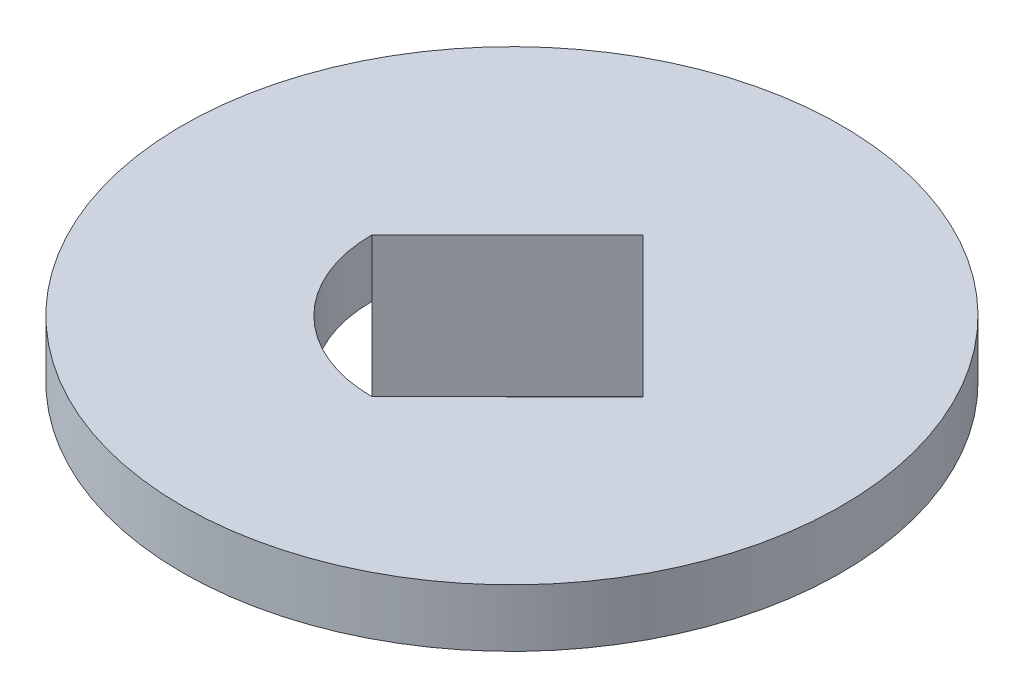
ISO-10303-21;
HEADER;
FILE_DESCRIPTION(('STEP AP214'),'2;1');
FILE_NAME('part.step','',(''),(''),'','','');
FILE_SCHEMA(('AUTOMOTIVE_DESIGN { 1 0 10303 214 1 1 1 1 }'));
ENDSEC;
DATA;
#1=APPLICATION_CONTEXT('core data for automotive mechanical design processes');
#2=APPLICATION_PROTOCOL_DEFINITION('international standard','automotive_design',2000,#1);
#3=PRODUCT_CONTEXT('',#1,'mechanical');
#4=PRODUCT('Part','Part','',(#3));
#5=PRODUCT_RELATED_PRODUCT_CATEGORY('part','',(#4));
#6=PRODUCT_DEFINITION_FORMATION('','',#4);
#7=PRODUCT_DEFINITION_CONTEXT('part definition',#1,'design');
#8=PRODUCT_DEFINITION('design','',#6,#7);
#9=PRODUCT_DEFINITION_SHAPE('','',#8);
#10=(LENGTH_UNIT() NAMED_UNIT(*) SI_UNIT(.MILLI.,.METRE.));
#11=(NAMED_UNIT(*) PLANE_ANGLE_UNIT() SI_UNIT($,.RADIAN.));
#12=(NAMED_UNIT(*) SI_UNIT($,.STERADIAN.) SOLID_ANGLE_UNIT());
#13=UNCERTAINTY_MEASURE_WITH_UNIT(LENGTH_MEASURE(1.E-05),#10,'distance_accuracy_value','');
#14=(GEOMETRIC_REPRESENTATION_CONTEXT(3) GLOBAL_UNCERTAINTY_ASSIGNED_CONTEXT((#13)) GLOBAL_UNIT_ASSIGNED_CONTEXT((#10,
#11,#12)) REPRESENTATION_CONTEXT('',''));
#15=CARTESIAN_POINT('',(0.,0.,0.));
#16=DIRECTION('',(0.,0.,1.));
#17=DIRECTION('',(1.,0.,0.));
#18=AXIS2_PLACEMENT_3D('',#15,#16,#17);
#19=CARTESIAN_POINT('',(0.,1.75,0.));
#20=DIRECTION('',(0.,-1.,0.));
#21=DIRECTION('',(0.,0.,-1.));
#22=AXIS2_PLACEMENT_3D('',#19,#20,#21);
#23=CYLINDRICAL_SURFACE('',#22,10.);
#24=CARTESIAN_POINT('',(0.,1.75,0.));
#25=DIRECTION('',(0.,1.,0.));
#26=DIRECTION('',(0.,0.,1.));
#27=AXIS2_PLACEMENT_3D('',#24,#25,#26);
#28=CIRCLE('',#27,10.);
#29=CARTESIAN_POINT('',(0.,1.75,10.));
#30=VERTEX_POINT('',#29);
#31=EDGE_CURVE('E11',#30,#30,#28,.T.);
#32=ORIENTED_EDGE('',*,*,#31,.F.);
#33=EDGE_LOOP('',(#32));
#34=FACE_BOUND('',#33,.T.);
#35=CARTESIAN_POINT('',(0.,0.,0.));
#36=DIRECTION('',(0.,1.,0.));
#37=DIRECTION('',(0.,0.,1.));
#38=AXIS2_PLACEMENT_3D('',#35,#36,#37);
#39=CIRCLE('',#38,10.);
#40=CARTESIAN_POINT('',(0.,0.,10.));
#41=VERTEX_POINT('',#40);
#42=EDGE_CURVE('E42',#41,#41,#39,.T.);
#43=ORIENTED_EDGE('',*,*,#42,.T.);
#44=EDGE_LOOP('',(#43));
#45=FACE_BOUND('',#44,.T.);
#46=ADVANCED_FACE('F39',(#34,#45),#23,.T.);
#47=CARTESIAN_POINT('',(0.,1.75,0.));
#48=DIRECTION('',(0.,1.,0.));
#49=DIRECTION('',(0.,0.,1.));
#50=AXIS2_PLACEMENT_3D('',#47,#48,#49);
#51=PLANE('',#50);
#52=DIRECTION('',(-0.707106781186559,0.,0.707106781186536));
#53=VECTOR('',#52,1.);
#54=CARTESIAN_POINT('',(-2.12499999999995,1.75,-2.12500000000002));
#55=LINE('',#54,#53);
#56=CARTESIAN_POINT('',(-0.138270177077543,1.75,-4.11172982292236));
#57=VERTEX_POINT('',#56);
#58=CARTESIAN_POINT('',(-4.25,1.75,0.));
#59=VERTEX_POINT('',#58);
#60=EDGE_CURVE('E110',#57,#59,#55,.T.);
#61=ORIENTED_EDGE('',*,*,#60,.F.);
#62=DIRECTION('',(-0.707106781186547,0.,-0.707106781186548));
#63=VECTOR('',#62,1.);
#64=CARTESIAN_POINT('',(1.98672982292241,1.75,-1.98672982292241));
#65=LINE('',#64,#63);
#66=CARTESIAN_POINT('',(4.11926668484489,1.75,0.145807039000079));
#67=VERTEX_POINT('',#66);
#68=EDGE_CURVE('E133',#67,#57,#65,.T.);
#69=ORIENTED_EDGE('',*,*,#68,.F.);
#70=DIRECTION('',(0.708401728339931,0.,-0.705809458200298));
#71=VECTOR('',#70,1.);
#72=CARTESIAN_POINT('',(2.12498572028798,1.75,2.13279028703875));
#73=LINE('',#72,#71);
#74=CARTESIAN_POINT('',(0.,1.75,4.25));
#75=VERTEX_POINT('',#74);
#76=EDGE_CURVE('E131',#75,#67,#73,.T.);
#77=ORIENTED_EDGE('',*,*,#76,.F.);
#78=CARTESIAN_POINT('',(0.,1.75,0.));
#79=DIRECTION('',(0.,1.,0.));
#80=DIRECTION('',(0.,0.,1.));
#81=AXIS2_PLACEMENT_3D('',#78,#79,#80);
#82=CIRCLE('',#81,4.25);
#83=EDGE_CURVE('E89',#59,#75,#82,.T.);
#84=ORIENTED_EDGE('',*,*,#83,.F.);
#85=EDGE_LOOP('',(#61,#69,#77,#84));
#86=FACE_BOUND('',#85,.T.);
#87=ORIENTED_EDGE('',*,*,#31,.T.);
#88=EDGE_LOOP('',(#87));
#89=FACE_BOUND('',#88,.T.);
#90=ADVANCED_FACE('F140',(#86,#89),#51,.T.);
#91=CARTESIAN_POINT('',(0.,0.,0.));
#92=DIRECTION('',(0.,1.,0.));
#93=DIRECTION('',(0.,0.,1.));
#94=AXIS2_PLACEMENT_3D('',#91,#92,#93);
#95=PLANE('',#94);
#96=CARTESIAN_POINT('',(0.,0.,0.));
#97=DIRECTION('',(0.,-1.,0.));
#98=DIRECTION('',(0.,0.,1.));
#99=AXIS2_PLACEMENT_3D('',#96,#97,#98);
#100=CIRCLE('',#99,4.25);
#101=CARTESIAN_POINT('',(-4.25,0.,0.));
#102=VERTEX_POINT('',#101);
#103=CARTESIAN_POINT('',(0.,0.,4.25));
#104=VERTEX_POINT('',#103);
#105=EDGE_CURVE('E100',#102,#104,#100,.T.);
#106=ORIENTED_EDGE('',*,*,#105,.F.);
#107=CARTESIAN_POINT('',(0.,0.,0.));
#108=DIRECTION('',(0.,-1.,0.));
#109=DIRECTION('',(0.,0.,1.));
#110=AXIS2_PLACEMENT_3D('',#107,#108,#109);
#111=CIRCLE('',#110,4.25);
#112=EDGE_CURVE('E61',#104,#102,#111,.T.);
#113=ORIENTED_EDGE('',*,*,#112,.F.);
#114=EDGE_LOOP('',(#106,#113));
#115=FACE_BOUND('',#114,.T.);
#116=ORIENTED_EDGE('',*,*,#42,.F.);
#117=EDGE_LOOP('',(#116));
#118=FACE_BOUND('',#117,.T.);
#119=ADVANCED_FACE('F98',(#115,#118),#95,.F.);
#120=CARTESIAN_POINT('',(4.11926668484489,-2.5,0.145807039000079));
#121=DIRECTION('',(0.7058094582003,0.,0.70840172833993));
#122=DIRECTION('',(0.70840172833993,0.,-0.7058094582003));
#123=AXIS2_PLACEMENT_3D('',#120,#121,#122);
#124=PLANE('',#123);
#125=DIRECTION('',(0.,1.,0.));
#126=VECTOR('',#125,1.);
#127=CARTESIAN_POINT('',(0.,-2.5,4.25));
#128=LINE('',#127,#126);
#129=CARTESIAN_POINT('',(0.,-2.5,4.25));
#130=VERTEX_POINT('',#129);
#131=EDGE_CURVE('E106',#130,#104,#128,.T.);
#132=ORIENTED_EDGE('',*,*,#131,.T.);
#133=DIRECTION('',(0.,-1.,0.));
#134=VECTOR('',#133,1.);
#135=CARTESIAN_POINT('',(0.,2.5,4.25));
#136=LINE('',#135,#134);
#137=EDGE_CURVE('E86',#75,#104,#136,.T.);
#138=ORIENTED_EDGE('',*,*,#137,.F.);
#139=ORIENTED_EDGE('',*,*,#76,.T.);
#140=DIRECTION('',(0.,1.,0.));
#141=VECTOR('',#140,1.);
#142=CARTESIAN_POINT('',(4.11926668484489,-2.5,0.145807039000079));
#143=LINE('',#142,#141);
#144=CARTESIAN_POINT('',(4.11926668484489,-2.5,0.145807039000079));
#145=VERTEX_POINT('',#144);
#146=EDGE_CURVE('E53',#145,#67,#143,.T.);
#147=ORIENTED_EDGE('',*,*,#146,.F.);
#148=DIRECTION('',(0.70840172833993,0.,-0.7058094582003));
#149=VECTOR('',#148,1.);
#150=CARTESIAN_POINT('',(4.11926668484489,-2.5,0.145807039000079));
#151=LINE('',#150,#149);
#152=EDGE_CURVE('E113',#130,#145,#151,.T.);
#153=ORIENTED_EDGE('',*,*,#152,.F.);
#154=EDGE_LOOP('',(#132,#138,#139,#147,#153));
#155=FACE_BOUND('',#154,.T.);
#156=ADVANCED_FACE('F112',(#155),#124,.F.);
#157=CARTESIAN_POINT('',(-0.138270177077543,-2.5,-4.11172982292236));
#158=DIRECTION('',(0.707106781186548,0.,-0.707106781186547));
#159=DIRECTION('',(-0.707106781186547,0.,-0.707106781186548));
#160=AXIS2_PLACEMENT_3D('',#157,#158,#159);
#161=PLANE('',#160);
#162=ORIENTED_EDGE('',*,*,#146,.T.);
#163=ORIENTED_EDGE('',*,*,#68,.T.);
#164=DIRECTION('',(0.,1.,0.));
#165=VECTOR('',#164,1.);
#166=CARTESIAN_POINT('',(-0.138270177077543,-2.5,-4.11172982292236));
#167=LINE('',#166,#165);
#168=CARTESIAN_POINT('',(-0.138270177077543,-2.5,-4.11172982292236));
#169=VERTEX_POINT('',#168);
#170=EDGE_CURVE('E117',#169,#57,#167,.T.);
#171=ORIENTED_EDGE('',*,*,#170,.F.);
#172=DIRECTION('',(-0.707106781186547,0.,-0.707106781186548));
#173=VECTOR('',#172,1.);
#174=CARTESIAN_POINT('',(-0.138270177077543,-2.5,-4.11172982292236));
#175=LINE('',#174,#173);
#176=EDGE_CURVE('E125',#145,#169,#175,.T.);
#177=ORIENTED_EDGE('',*,*,#176,.F.);
#178=EDGE_LOOP('',(#162,#163,#171,#177));
#179=FACE_BOUND('',#178,.T.);
#180=ADVANCED_FACE('F144',(#179),#161,.F.);
#181=CARTESIAN_POINT('',(-4.25,-2.5,0.));
#182=DIRECTION('',(-0.707106781186539,0.,-0.707106781186556));
#183=DIRECTION('',(-0.707106781186556,0.,0.707106781186539));
#184=AXIS2_PLACEMENT_3D('',#181,#182,#183);
#185=PLANE('',#184);
#186=ORIENTED_EDGE('',*,*,#170,.T.);
#187=ORIENTED_EDGE('',*,*,#60,.T.);
#188=DIRECTION('',(0.,-1.,0.));
#189=VECTOR('',#188,1.);
#190=CARTESIAN_POINT('',(-4.25,2.5,0.));
#191=LINE('',#190,#189);
#192=EDGE_CURVE('E93',#59,#102,#191,.T.);
#193=ORIENTED_EDGE('',*,*,#192,.T.);
#194=DIRECTION('',(0.,1.,0.));
#195=VECTOR('',#194,1.);
#196=CARTESIAN_POINT('',(-4.25,-2.5,0.));
#197=LINE('',#196,#195);
#198=CARTESIAN_POINT('',(-4.25,-2.5,0.));
#199=VERTEX_POINT('',#198);
#200=EDGE_CURVE('E108',#199,#102,#197,.T.);
#201=ORIENTED_EDGE('',*,*,#200,.F.);
#202=DIRECTION('',(-0.707106781186556,0.,0.707106781186539));
#203=VECTOR('',#202,1.);
#204=CARTESIAN_POINT('',(-4.25,-2.5,0.));
#205=LINE('',#204,#203);
#206=EDGE_CURVE('E121',#169,#199,#205,.T.);
#207=ORIENTED_EDGE('',*,*,#206,.F.);
#208=EDGE_LOOP('',(#186,#187,#193,#201,#207));
#209=FACE_BOUND('',#208,.T.);
#210=ADVANCED_FACE('F136',(#209),#185,.F.);
#211=CARTESIAN_POINT('',(0.,-2.5,0.));
#212=DIRECTION('',(0.,1.,0.));
#213=DIRECTION('',(0.,0.,1.));
#214=AXIS2_PLACEMENT_3D('',#211,#212,#213);
#215=CYLINDRICAL_SURFACE('',#214,4.25);
#216=ORIENTED_EDGE('',*,*,#105,.T.);
#217=ORIENTED_EDGE('',*,*,#131,.F.);
#218=CARTESIAN_POINT('',(0.,-2.5,0.));
#219=DIRECTION('',(0.,-1.,0.));
#220=DIRECTION('',(0.,0.,-1.));
#221=AXIS2_PLACEMENT_3D('',#218,#219,#220);
#222=CIRCLE('',#221,4.25);
#223=EDGE_CURVE('E109',#199,#130,#222,.T.);
#224=ORIENTED_EDGE('',*,*,#223,.F.);
#225=ORIENTED_EDGE('',*,*,#200,.T.);
#226=EDGE_LOOP('',(#216,#217,#224,#225));
#227=FACE_BOUND('',#226,.T.);
#228=ADVANCED_FACE('F105',(#227),#215,.T.);
#229=CARTESIAN_POINT('',(0.,-2.5,0.));
#230=DIRECTION('',(0.,-1.,0.));
#231=DIRECTION('',(0.,0.,-1.));
#232=AXIS2_PLACEMENT_3D('',#229,#230,#231);
#233=PLANE('',#232);
#234=ORIENTED_EDGE('',*,*,#223,.T.);
#235=ORIENTED_EDGE('',*,*,#152,.T.);
#236=ORIENTED_EDGE('',*,*,#176,.T.);
#237=ORIENTED_EDGE('',*,*,#206,.T.);
#238=EDGE_LOOP('',(#234,#235,#236,#237));
#239=FACE_BOUND('',#238,.T.);
#240=ADVANCED_FACE('F146',(#239),#233,.T.);
#241=CARTESIAN_POINT('',(0.,2.5,0.));
#242=DIRECTION('',(0.,-1.,0.));
#243=DIRECTION('',(0.,0.,-1.));
#244=AXIS2_PLACEMENT_3D('',#241,#242,#243);
#245=CYLINDRICAL_SURFACE('',#244,4.25);
#246=ORIENTED_EDGE('',*,*,#83,.T.);
#247=ORIENTED_EDGE('',*,*,#137,.T.);
#248=ORIENTED_EDGE('',*,*,#112,.T.);
#249=ORIENTED_EDGE('',*,*,#192,.F.);
#250=EDGE_LOOP('',(#246,#247,#248,#249));
#251=FACE_BOUND('',#250,.T.);
#252=ADVANCED_FACE('F87',(#251),#245,.F.);
#253=CLOSED_SHELL('',(#46,#90,#119,#156,#180,#210,#228,#240,#252));
#254=MANIFOLD_SOLID_BREP('B2',#253);
#255=ADVANCED_BREP_SHAPE_REPRESENTATION('',(#18,#254),#14);
#256=SHAPE_DEFINITION_REPRESENTATION(#9,#255);
ENDSEC;
END-ISO-10303-21;
